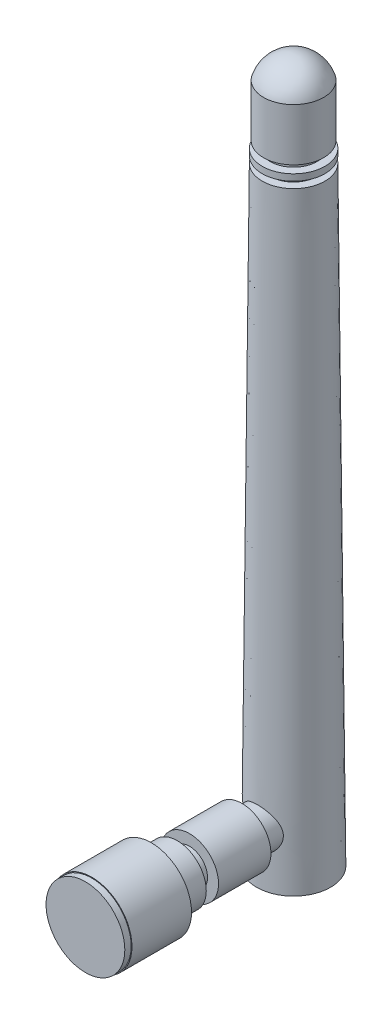
ISO-10303-21;
HEADER;
FILE_DESCRIPTION(('STEP AP214'),'2;1');
FILE_NAME('part.step','',(''),(''),'','','');
FILE_SCHEMA(('AUTOMOTIVE_DESIGN { 1 0 10303 214 1 1 1 1 }'));
ENDSEC;
DATA;
#1=APPLICATION_CONTEXT('core data for automotive mechanical design processes');
#2=APPLICATION_PROTOCOL_DEFINITION('international standard','automotive_design',2000,#1);
#3=PRODUCT_CONTEXT('',#1,'mechanical');
#4=PRODUCT('Part','Part','',(#3));
#5=PRODUCT_RELATED_PRODUCT_CATEGORY('part','',(#4));
#6=PRODUCT_DEFINITION_FORMATION('','',#4);
#7=PRODUCT_DEFINITION_CONTEXT('part definition',#1,'design');
#8=PRODUCT_DEFINITION('design','',#6,#7);
#9=PRODUCT_DEFINITION_SHAPE('','',#8);
#10=(LENGTH_UNIT() NAMED_UNIT(*) SI_UNIT(.MILLI.,.METRE.));
#11=(NAMED_UNIT(*) PLANE_ANGLE_UNIT() SI_UNIT($,.RADIAN.));
#12=(NAMED_UNIT(*) SI_UNIT($,.STERADIAN.) SOLID_ANGLE_UNIT());
#13=UNCERTAINTY_MEASURE_WITH_UNIT(LENGTH_MEASURE(1.E-05),#10,'distance_accuracy_value','');
#14=(GEOMETRIC_REPRESENTATION_CONTEXT(3) GLOBAL_UNCERTAINTY_ASSIGNED_CONTEXT((#13)) GLOBAL_UNIT_ASSIGNED_CONTEXT((#10,
#11,#12)) REPRESENTATION_CONTEXT('',''));
#15=CARTESIAN_POINT('',(0.,0.,0.));
#16=DIRECTION('',(0.,0.,1.));
#17=DIRECTION('',(1.,0.,0.));
#18=AXIS2_PLACEMENT_3D('',#15,#16,#17);
#19=CARTESIAN_POINT('',(0.,66.878718358439,0.));
#20=DIRECTION('',(0.,-1.,0.));
#21=DIRECTION('',(0.,0.,-1.));
#22=AXIS2_PLACEMENT_3D('',#19,#20,#21);
#23=CONICAL_SURFACE('',#22,3.9,0.00924068126425706);
#24=CARTESIAN_POINT('',(0.,66.878718358439,0.));
#25=DIRECTION('',(0.,1.,0.));
#26=DIRECTION('',(0.,0.,1.));
#27=AXIS2_PLACEMENT_3D('',#24,#25,#26);
#28=CIRCLE('',#27,3.9);
#29=CARTESIAN_POINT('',(0.,66.878718358439,3.9));
#30=VERTEX_POINT('',#29);
#31=EDGE_CURVE('E59',#30,#30,#28,.T.);
#32=ORIENTED_EDGE('',*,*,#31,.F.);
#33=EDGE_LOOP('',(#32));
#34=FACE_BOUND('',#33,.T.);
#35=CARTESIAN_POINT('',(0.,-8.87111604136676,0.));
#36=DIRECTION('',(0.,1.,0.));
#37=DIRECTION('',(0.,0.,1.));
#38=AXIS2_PLACEMENT_3D('',#35,#36,#37);
#39=CIRCLE('',#38,4.6);
#40=CARTESIAN_POINT('',(0.,-8.87111604136676,4.6));
#41=VERTEX_POINT('',#40);
#42=EDGE_CURVE('E56',#41,#41,#39,.T.);
#43=ORIENTED_EDGE('',*,*,#42,.T.);
#44=EDGE_LOOP('',(#43));
#45=FACE_BOUND('',#44,.T.);
#46=CARTESIAN_POINT('',(-1.81188369998939,-4.24712340383272,4.18160098269724));
#47=CARTESIAN_POINT('',(-1.90800079422493,-4.14686668908235,4.13894246014809));
#48=CARTESIAN_POINT('',(-1.99573985291126,-4.03870366584505,4.09585518862893));
#49=CARTESIAN_POINT('',(-2.15272282887463,-3.80834609579547,4.01315878241409));
#50=CARTESIAN_POINT('',(-2.22195311607326,-3.68614130262508,3.97355222528666));
#51=CARTESIAN_POINT('',(-2.34010995372417,-3.42894562192491,3.90237666064731));
#52=CARTESIAN_POINT('',(-2.38890193865032,-3.2938769642189,3.87086143597426));
#53=CARTESIAN_POINT('',(-2.46289967519262,-3.01518083519823,3.82115795220368));
#54=CARTESIAN_POINT('',(-2.48815075347143,-2.87157038045745,3.80294409680322));
#55=CARTESIAN_POINT('',(-2.51182158690223,-2.59792070904129,3.78430635381626));
#56=CARTESIAN_POINT('',(-2.51301905053102,-2.46824441868406,3.78206064735321));
#57=CARTESIAN_POINT('',(-2.49547427269947,-2.21069750159278,3.7908101387166));
#58=CARTESIAN_POINT('',(-2.47672997236209,-2.08282706268417,3.80180670374992));
#59=CARTESIAN_POINT('',(-2.42265225103293,-1.84294752338989,3.83384056953348));
#60=CARTESIAN_POINT('',(-2.38875959666115,-1.73048641458978,3.85400804463788));
#61=CARTESIAN_POINT('',(-2.30634544409267,-1.51271013373263,3.90154613502375));
#62=CARTESIAN_POINT('',(-2.2578194018209,-1.40739719384401,3.92891898743978));
#63=CARTESIAN_POINT('',(-2.14076176255133,-1.19318276158147,3.9917836547549));
#64=CARTESIAN_POINT('',(-2.07052002229425,-1.08538878455003,4.02785708749345));
#65=CARTESIAN_POINT('',(-1.91484876583947,-0.882132709184086,4.1020788403));
#66=CARTESIAN_POINT('',(-1.82940753841142,-0.786680218619441,4.1402287444485));
#67=CARTESIAN_POINT('',(-1.63228085024748,-0.597707219787739,4.2202950378212));
#68=CARTESIAN_POINT('',(-1.51861265138628,-0.506161136195988,4.26203074215315));
#69=CARTESIAN_POINT('',(-1.27564273261851,-0.343382655646764,4.33937522664175));
#70=CARTESIAN_POINT('',(-1.14634344287379,-0.272147106784256,4.37498495712153));
#71=CARTESIAN_POINT('',(-0.878977790864915,-0.154534178069233,4.43520645350547));
#72=CARTESIAN_POINT('',(-0.741261750653158,-0.107512101255404,4.46010019295468));
#73=CARTESIAN_POINT('',(-0.458203385548731,-0.0378892198873548,4.49733679951257));
#74=CARTESIAN_POINT('',(-0.312869376011272,-0.0152623459007339,4.50969306370323));
#75=CARTESIAN_POINT('',(-0.037278881926728,0.00306525281243654,4.51969389962914));
#76=CARTESIAN_POINT('',(0.0927386295809656,0.00162200356391065,4.51889901287441));
#77=CARTESIAN_POINT('',(0.35046257897627,-0.0212243623612817,4.50645172902873));
#78=CARTESIAN_POINT('',(0.478169246495492,-0.0426254845704317,4.49480041686252));
#79=CARTESIAN_POINT('',(0.723056775089021,-0.103207422776035,4.46240564535786));
#80=CARTESIAN_POINT('',(0.840451064279318,-0.141720333362131,4.44200465511752));
#81=CARTESIAN_POINT('',(1.06706734723755,-0.234805963623182,4.39396593924427));
#82=CARTESIAN_POINT('',(1.17628776496449,-0.289381770502136,4.36632682259428));
#83=CARTESIAN_POINT('',(1.3932812799913,-0.418083474394753,4.30348844900184));
#84=CARTESIAN_POINT('',(1.50018863127294,-0.493452398229985,4.26785314408554));
#85=CARTESIAN_POINT('',(1.70055560256624,-0.659266319264017,4.19370505684889));
#86=CARTESIAN_POINT('',(1.79400230704137,-0.749725618522834,4.15518956409001));
#87=CARTESIAN_POINT('',(1.9755563999417,-0.954950156209934,4.07436567702127));
#88=CARTESIAN_POINT('',(2.06190598794735,-1.07130100687768,4.03211333923057));
#89=CARTESIAN_POINT('',(2.21396216113315,-1.3185232217939,3.95328941459588));
#90=CARTESIAN_POINT('',(2.27968478437157,-1.44938319710291,3.91671342547011));
#91=CARTESIAN_POINT('',(2.37851300073252,-1.69902023350925,3.86005035798532));
#92=CARTESIAN_POINT('',(2.41530554299804,-1.81593297759047,3.83820104226189));
#93=CARTESIAN_POINT('',(2.47155026523378,-2.05523870209952,3.80486951809274));
#94=CARTESIAN_POINT('',(2.49102228368447,-2.1776252437211,3.79337544882109));
#95=CARTESIAN_POINT('',(2.51167834731379,-2.42488539887103,3.78247690888621));
#96=CARTESIAN_POINT('',(2.51280467628148,-2.54976562445247,3.78311057894174));
#97=CARTESIAN_POINT('',(2.49661048160589,-2.79767607685629,3.79655636873999));
#98=CARTESIAN_POINT('',(2.47928235701406,-2.92070552021225,3.8093735063282));
#99=CARTESIAN_POINT('',(2.42832451693941,-3.15618767559648,3.84461385739231));
#100=CARTESIAN_POINT('',(2.39542388302347,-3.26886770047523,3.86660267386873));
#101=CARTESIAN_POINT('',(2.31498863569296,-3.48714812891895,3.91763122529498));
#102=CARTESIAN_POINT('',(2.26744880061174,-3.59274598994879,3.94667347535654));
#103=CARTESIAN_POINT('',(2.152068713143,-3.80841910553983,4.0131463489087));
#104=CARTESIAN_POINT('',(2.0824077790829,-3.91733423684227,4.05117498699361));
#105=CARTESIAN_POINT('',(1.92763406269446,-4.12285708921694,4.12916314254925));
#106=CARTESIAN_POINT('',(1.84250911852169,-4.21945502079544,4.16912416148099));
#107=CARTESIAN_POINT('',(1.64579052054966,-4.41083106274781,4.25285277511971));
#108=CARTESIAN_POINT('',(1.5321802744262,-4.50364361756357,4.2964160996338));
#109=CARTESIAN_POINT('',(1.28891847312818,-4.6688998382838,4.37713796820322));
#110=CARTESIAN_POINT('',(1.15926987199316,-4.74134724714173,4.41429768870409));
#111=CARTESIAN_POINT('',(0.891465115606681,-4.86088057030074,4.47705172784531));
#112=CARTESIAN_POINT('',(0.753731643879434,-4.90872541904655,4.5029876364801));
#113=CARTESIAN_POINT('',(0.470375830295851,-4.97994154816484,4.5419811271118));
#114=CARTESIAN_POINT('',(0.324762670127483,-5.00334069407911,4.55505337134942));
#115=CARTESIAN_POINT('',(0.0492038123630123,-5.02294052758894,4.56599791967481));
#116=CARTESIAN_POINT('',(-0.0804715112672798,-5.02212674449568,4.56553876264345));
#117=CARTESIAN_POINT('',(-0.337633643060869,-5.00062965875537,4.55354607611887));
#118=CARTESIAN_POINT('',(-0.465120608930987,-4.9799477940983,4.54201334809633));
#119=CARTESIAN_POINT('',(-0.709303045863642,-4.92094470767937,4.5096556517351));
#120=CARTESIAN_POINT('',(-0.826225390686674,-4.88334093448581,4.48920959322916));
#121=CARTESIAN_POINT('',(-1.05201162443628,-4.79225146168992,4.44086232468479));
#122=CARTESIAN_POINT('',(-1.16087529635004,-4.73876533458432,4.41296091397364));
#123=CARTESIAN_POINT('',(-1.36621316395028,-4.61898563306535,4.35255056486455));
#124=CARTESIAN_POINT('',(-1.46291890831163,-4.55302365971327,4.32016573240169));
#125=CARTESIAN_POINT('',(-1.64565813478,-4.40892032578009,4.25248789156414));
#126=CARTESIAN_POINT('',(-1.73168715091119,-4.33077389918785,4.21719367642592));
#127=CARTESIAN_POINT('',(-1.81188369998939,-4.24712340383272,4.18160098269724));
#128=B_SPLINE_CURVE_WITH_KNOTS('',3,(#46,#47,#48,#49,#50,#51,#52,#53,#54,#55,#56,#57,#58,#59,
#60,#61,#62,#63,#64,#65,#66,#67,#68,#69,#70,#71,#72,#73,#74,#75,#76,#77,#78,#79,#80,#81,#82,#83,
#84,#85,#86,#87,#88,#89,#90,#91,#92,#93,#94,#95,#96,#97,#98,#99,#100,#101,#102,#103,#104,#105,
#106,#107,#108,#109,#110,#111,#112,#113,#114,#115,#116,#117,#118,#119,#120,#121,#122,#123,#124,
#125,#126,#127),.UNSPECIFIED.,.T.,.F.,(4,2,2,2,2,2,2,2,2,2,2,2,2,2,2,2,2,2,2,2,2,2,2,2,2,2,2,2,
2,2,2,2,2,2,2,2,2,2,2,2,4),(0.,0.435486898235772,0.871293616297721,1.30992621816669,
1.74771250323975,2.13461006315413,2.5215475719825,2.87765509093757,3.23387330527936,
3.6331913765922,4.03281846638509,4.48601873608434,4.93914863724422,5.3794927527848,
5.8193658357944,6.20746025851896,6.59551590162088,6.96959952143097,7.3437550851425,
7.74883533245428,8.15430170297281,8.60498863004513,9.05532426192376,9.42723655076879,
9.79872231032598,10.1713765527451,10.5441843419246,10.9010436902656,11.2580304747427,
11.6607608252294,12.0638092896338,12.5206795665569,12.9774658193376,13.419158138763,
13.860346424009,14.2473894037885,14.6344043727111,15.0063648298525,15.3783352999133,
15.7415380478543,16.1048922117005),.UNSPECIFIED.);
#129=CARTESIAN_POINT('',(-1.81188369998939,-4.24712340383272,4.18160098269724));
#130=VERTEX_POINT('',#129);
#131=EDGE_CURVE('E36',#130,#130,#128,.T.);
#132=ORIENTED_EDGE('',*,*,#131,.T.);
#133=EDGE_LOOP('',(#132));
#134=FACE_BOUND('',#133,.T.);
#135=ADVANCED_FACE('F32',(#34,#45,#134),#23,.T.);
#136=CARTESIAN_POINT('',(-2.89999999999999,68.478718358439,0.));
#137=DIRECTION('',(0.,1.,0.));
#138=DIRECTION('',(0.,0.,1.));
#139=AXIS2_PLACEMENT_3D('',#136,#137,#138);
#140=PLANE('',#139);
#141=CARTESIAN_POINT('',(0.,68.478718358439,0.));
#142=DIRECTION('',(0.,1.,0.));
#143=DIRECTION('',(0.,0.,1.));
#144=AXIS2_PLACEMENT_3D('',#141,#142,#143);
#145=CIRCLE('',#144,3.9);
#146=CARTESIAN_POINT('',(0.,68.478718358439,3.9));
#147=VERTEX_POINT('',#146);
#148=EDGE_CURVE('E71',#147,#147,#145,.T.);
#149=ORIENTED_EDGE('',*,*,#148,.T.);
#150=EDGE_LOOP('',(#149));
#151=FACE_BOUND('',#150,.T.);
#152=CARTESIAN_POINT('',(0.,68.478718358439,0.));
#153=DIRECTION('',(0.,1.,0.));
#154=DIRECTION('',(0.,0.,1.));
#155=AXIS2_PLACEMENT_3D('',#152,#153,#154);
#156=CIRCLE('',#155,2.89999999999999);
#157=CARTESIAN_POINT('',(0.,68.478718358439,2.89999999999999));
#158=VERTEX_POINT('',#157);
#159=EDGE_CURVE('E10',#158,#158,#156,.T.);
#160=ORIENTED_EDGE('',*,*,#159,.F.);
#161=EDGE_LOOP('',(#160));
#162=FACE_BOUND('',#161,.T.);
#163=ADVANCED_FACE('F34',(#151,#162),#140,.T.);
#164=CARTESIAN_POINT('',(0.,100.774977187123,0.));
#165=DIRECTION('',(0.,1.,0.));
#166=DIRECTION('',(0.,0.,1.));
#167=AXIS2_PLACEMENT_3D('',#164,#165,#166);
#168=CYLINDRICAL_SURFACE('',#167,2.89999999999999);
#169=ORIENTED_EDGE('',*,*,#159,.T.);
#170=EDGE_LOOP('',(#169));
#171=FACE_BOUND('',#170,.T.);
#172=CARTESIAN_POINT('',(0.,69.3165062893689,0.));
#173=DIRECTION('',(0.,1.,0.));
#174=DIRECTION('',(0.,0.,1.));
#175=AXIS2_PLACEMENT_3D('',#172,#173,#174);
#176=CIRCLE('',#175,2.89999999999999);
#177=CARTESIAN_POINT('',(0.,69.3165062893689,2.89999999999999));
#178=VERTEX_POINT('',#177);
#179=EDGE_CURVE('E44',#178,#178,#176,.T.);
#180=ORIENTED_EDGE('',*,*,#179,.F.);
#181=EDGE_LOOP('',(#180));
#182=FACE_BOUND('',#181,.T.);
#183=ADVANCED_FACE('F187',(#171,#182),#168,.T.);
#184=CARTESIAN_POINT('',(-2.89999999999999,69.3165062893689,0.));
#185=DIRECTION('',(0.,-1.,0.));
#186=DIRECTION('',(0.,0.,-1.));
#187=AXIS2_PLACEMENT_3D('',#184,#185,#186);
#188=PLANE('',#187);
#189=ORIENTED_EDGE('',*,*,#179,.T.);
#190=EDGE_LOOP('',(#189));
#191=FACE_BOUND('',#190,.T.);
#192=CARTESIAN_POINT('',(0.,69.3165062893689,0.));
#193=DIRECTION('',(0.,1.,0.));
#194=DIRECTION('',(0.,0.,1.));
#195=AXIS2_PLACEMENT_3D('',#192,#193,#194);
#196=CIRCLE('',#195,3.73509107576063);
#197=CARTESIAN_POINT('',(0.,69.3165062893689,3.73509107576063));
#198=VERTEX_POINT('',#197);
#199=EDGE_CURVE('E48',#198,#198,#196,.T.);
#200=ORIENTED_EDGE('',*,*,#199,.F.);
#201=EDGE_LOOP('',(#200));
#202=FACE_BOUND('',#201,.T.);
#203=ADVANCED_FACE('F207',(#191,#202),#188,.T.);
#204=CARTESIAN_POINT('',(0.,100.774977187123,0.));
#205=DIRECTION('',(0.,1.,0.));
#206=DIRECTION('',(0.,0.,1.));
#207=AXIS2_PLACEMENT_3D('',#204,#205,#206);
#208=CYLINDRICAL_SURFACE('',#207,3.73509107576063);
#209=ORIENTED_EDGE('',*,*,#199,.T.);
#210=EDGE_LOOP('',(#209));
#211=FACE_BOUND('',#210,.T.);
#212=CARTESIAN_POINT('',(0.,75.8165062893689,0.));
#213=DIRECTION('',(0.,1.,0.));
#214=DIRECTION('',(0.,0.,1.));
#215=AXIS2_PLACEMENT_3D('',#212,#213,#214);
#216=CIRCLE('',#215,3.73509107576063);
#217=CARTESIAN_POINT('',(0.,75.8165062893689,3.73509107576063));
#218=VERTEX_POINT('',#217);
#219=EDGE_CURVE('E53',#218,#218,#216,.T.);
#220=ORIENTED_EDGE('',*,*,#219,.F.);
#221=EDGE_LOOP('',(#220));
#222=FACE_BOUND('',#221,.T.);
#223=ADVANCED_FACE('F203',(#211,#222),#208,.T.);
#224=CARTESIAN_POINT('',(0.,74.7424262936992,0.));
#225=DIRECTION('',(0.,1.,0.));
#226=DIRECTION('',(-1.,0.,0.));
#227=AXIS2_PLACEMENT_3D('',#224,#225,#226);
#228=SPHERICAL_SURFACE('',#227,3.88645766493405);
#229=ORIENTED_EDGE('',*,*,#219,.T.);
#230=EDGE_LOOP('',(#229));
#231=FACE_BOUND('',#230,.T.);
#232=ADVANCED_FACE('F199',(#231),#228,.T.);
#233=CARTESIAN_POINT('',(0.,-8.87111604136676,0.));
#234=DIRECTION('',(0.,-1.,0.));
#235=DIRECTION('',(0.,0.,-1.));
#236=AXIS2_PLACEMENT_3D('',#233,#234,#235);
#237=PLANE('',#236);
#238=ORIENTED_EDGE('',*,*,#42,.F.);
#239=EDGE_LOOP('',(#238));
#240=FACE_BOUND('',#239,.T.);
#241=ADVANCED_FACE('F196',(#240),#237,.T.);
#242=CARTESIAN_POINT('',(-3.9,66.878718358439,0.));
#243=DIRECTION('',(0.,1.,0.));
#244=DIRECTION('',(0.,0.,1.));
#245=AXIS2_PLACEMENT_3D('',#242,#243,#244);
#246=PLANE('',#245);
#247=ORIENTED_EDGE('',*,*,#31,.T.);
#248=EDGE_LOOP('',(#247));
#249=FACE_BOUND('',#248,.T.);
#250=CARTESIAN_POINT('',(0.,66.878718358439,0.));
#251=DIRECTION('',(0.,1.,0.));
#252=DIRECTION('',(0.,0.,1.));
#253=AXIS2_PLACEMENT_3D('',#250,#251,#252);
#254=CIRCLE('',#253,2.89999999999999);
#255=CARTESIAN_POINT('',(0.,66.878718358439,2.89999999999999));
#256=VERTEX_POINT('',#255);
#257=EDGE_CURVE('E62',#256,#256,#254,.T.);
#258=ORIENTED_EDGE('',*,*,#257,.F.);
#259=EDGE_LOOP('',(#258));
#260=FACE_BOUND('',#259,.T.);
#261=ADVANCED_FACE('F194',(#249,#260),#246,.T.);
#262=CARTESIAN_POINT('',(0.,100.774977187123,0.));
#263=DIRECTION('',(0.,1.,0.));
#264=DIRECTION('',(0.,0.,1.));
#265=AXIS2_PLACEMENT_3D('',#262,#263,#264);
#266=CYLINDRICAL_SURFACE('',#265,2.89999999999999);
#267=ORIENTED_EDGE('',*,*,#257,.T.);
#268=EDGE_LOOP('',(#267));
#269=FACE_BOUND('',#268,.T.);
#270=CARTESIAN_POINT('',(0.,67.678718358439,0.));
#271=DIRECTION('',(0.,1.,0.));
#272=DIRECTION('',(0.,0.,1.));
#273=AXIS2_PLACEMENT_3D('',#270,#271,#272);
#274=CIRCLE('',#273,2.89999999999999);
#275=CARTESIAN_POINT('',(0.,67.678718358439,2.89999999999999));
#276=VERTEX_POINT('',#275);
#277=EDGE_CURVE('E65',#276,#276,#274,.T.);
#278=ORIENTED_EDGE('',*,*,#277,.F.);
#279=EDGE_LOOP('',(#278));
#280=FACE_BOUND('',#279,.T.);
#281=ADVANCED_FACE('F244',(#269,#280),#266,.T.);
#282=CARTESIAN_POINT('',(-3.9,67.678718358439,0.));
#283=DIRECTION('',(0.,-1.,0.));
#284=DIRECTION('',(0.,0.,-1.));
#285=AXIS2_PLACEMENT_3D('',#282,#283,#284);
#286=PLANE('',#285);
#287=ORIENTED_EDGE('',*,*,#277,.T.);
#288=EDGE_LOOP('',(#287));
#289=FACE_BOUND('',#288,.T.);
#290=CARTESIAN_POINT('',(0.,67.678718358439,0.));
#291=DIRECTION('',(0.,1.,0.));
#292=DIRECTION('',(0.,0.,1.));
#293=AXIS2_PLACEMENT_3D('',#290,#291,#292);
#294=CIRCLE('',#293,3.9);
#295=CARTESIAN_POINT('',(0.,67.678718358439,3.9));
#296=VERTEX_POINT('',#295);
#297=EDGE_CURVE('E68',#296,#296,#294,.T.);
#298=ORIENTED_EDGE('',*,*,#297,.F.);
#299=EDGE_LOOP('',(#298));
#300=FACE_BOUND('',#299,.T.);
#301=ADVANCED_FACE('F177',(#289,#300),#286,.T.);
#302=CARTESIAN_POINT('',(0.,100.774977187123,0.));
#303=DIRECTION('',(0.,1.,0.));
#304=DIRECTION('',(0.,0.,1.));
#305=AXIS2_PLACEMENT_3D('',#302,#303,#304);
#306=CYLINDRICAL_SURFACE('',#305,3.9);
#307=ORIENTED_EDGE('',*,*,#297,.T.);
#308=EDGE_LOOP('',(#307));
#309=FACE_BOUND('',#308,.T.);
#310=ORIENTED_EDGE('',*,*,#148,.F.);
#311=EDGE_LOOP('',(#310));
#312=FACE_BOUND('',#311,.T.);
#313=ADVANCED_FACE('F172',(#309,#312),#306,.T.);
#314=CARTESIAN_POINT('',(0.,-2.51004947612662,44.5034584823365));
#315=DIRECTION('',(0.,0.,1.));
#316=DIRECTION('',(1.,0.,0.));
#317=AXIS2_PLACEMENT_3D('',#314,#315,#316);
#318=CYLINDRICAL_SURFACE('',#317,2.51004947612662);
#319=ORIENTED_EDGE('',*,*,#131,.F.);
#320=EDGE_LOOP('',(#319));
#321=FACE_BOUND('',#320,.T.);
#322=CARTESIAN_POINT('',(0.,-2.51004947612662,6.42927660341974));
#323=DIRECTION('',(0.,0.,1.));
#324=DIRECTION('',(1.,0.,0.));
#325=AXIS2_PLACEMENT_3D('',#322,#323,#324);
#326=CIRCLE('',#325,2.51004947612662);
#327=CARTESIAN_POINT('',(2.51004947612662,-2.51004947612662,6.42927660341974));
#328=VERTEX_POINT('',#327);
#329=EDGE_CURVE('E74',#328,#328,#326,.T.);
#330=ORIENTED_EDGE('',*,*,#329,.F.);
#331=EDGE_LOOP('',(#330));
#332=FACE_BOUND('',#331,.T.);
#333=ADVANCED_FACE('F167',(#321,#332),#318,.T.);
#334=CARTESIAN_POINT('',(0.,0.,6.42927660341974));
#335=DIRECTION('',(0.,0.,1.));
#336=DIRECTION('',(1.,0.,0.));
#337=AXIS2_PLACEMENT_3D('',#334,#335,#336);
#338=PLANE('',#337);
#339=CARTESIAN_POINT('',(0.,-2.51004947612662,6.42927660341974));
#340=DIRECTION('',(0.,0.,1.));
#341=DIRECTION('',(1.,0.,0.));
#342=AXIS2_PLACEMENT_3D('',#339,#340,#341);
#343=CIRCLE('',#342,3.60941360741938);
#344=CARTESIAN_POINT('',(3.60941360741938,-2.51004947612662,6.42927660341974));
#345=VERTEX_POINT('',#344);
#346=EDGE_CURVE('E77',#345,#345,#343,.T.);
#347=ORIENTED_EDGE('',*,*,#346,.F.);
#348=EDGE_LOOP('',(#347));
#349=FACE_BOUND('',#348,.T.);
#350=ORIENTED_EDGE('',*,*,#329,.T.);
#351=EDGE_LOOP('',(#350));
#352=FACE_BOUND('',#351,.T.);
#353=ADVANCED_FACE('F161',(#349,#352),#338,.F.);
#354=CARTESIAN_POINT('',(0.,-2.51004947612662,44.5034584823365));
#355=DIRECTION('',(0.,0.,1.));
#356=DIRECTION('',(1.,0.,0.));
#357=AXIS2_PLACEMENT_3D('',#354,#355,#356);
#358=CYLINDRICAL_SURFACE('',#357,3.60941360741938);
#359=CARTESIAN_POINT('',(0.,-2.51004947612662,12.95));
#360=DIRECTION('',(0.,0.,1.));
#361=DIRECTION('',(1.,0.,0.));
#362=AXIS2_PLACEMENT_3D('',#359,#360,#361);
#363=CIRCLE('',#362,3.60941360741938);
#364=CARTESIAN_POINT('',(3.60941360741938,-2.51004947612662,12.95));
#365=VERTEX_POINT('',#364);
#366=EDGE_CURVE('E80',#365,#365,#363,.T.);
#367=ORIENTED_EDGE('',*,*,#366,.F.);
#368=EDGE_LOOP('',(#367));
#369=FACE_BOUND('',#368,.T.);
#370=ORIENTED_EDGE('',*,*,#346,.T.);
#371=EDGE_LOOP('',(#370));
#372=FACE_BOUND('',#371,.T.);
#373=ADVANCED_FACE('F155',(#369,#372),#358,.T.);
#374=CARTESIAN_POINT('',(0.,-0.266872358286114,12.95));
#375=DIRECTION('',(0.,0.,-1.));
#376=DIRECTION('',(-1.,0.,0.));
#377=AXIS2_PLACEMENT_3D('',#374,#375,#376);
#378=PLANE('',#377);
#379=CARTESIAN_POINT('',(0.,-2.51004947612662,12.95));
#380=DIRECTION('',(0.,0.,1.));
#381=DIRECTION('',(1.,0.,0.));
#382=AXIS2_PLACEMENT_3D('',#379,#380,#381);
#383=CIRCLE('',#382,2.24317711784051);
#384=CARTESIAN_POINT('',(2.24317711784051,-2.51004947612662,12.95));
#385=VERTEX_POINT('',#384);
#386=EDGE_CURVE('E83',#385,#385,#383,.T.);
#387=ORIENTED_EDGE('',*,*,#386,.F.);
#388=EDGE_LOOP('',(#387));
#389=FACE_BOUND('',#388,.T.);
#390=ORIENTED_EDGE('',*,*,#366,.T.);
#391=EDGE_LOOP('',(#390));
#392=FACE_BOUND('',#391,.T.);
#393=ADVANCED_FACE('F149',(#389,#392),#378,.F.);
#394=CARTESIAN_POINT('',(0.,-2.51004947612662,44.5034584823365));
#395=DIRECTION('',(0.,0.,1.));
#396=DIRECTION('',(1.,0.,0.));
#397=AXIS2_PLACEMENT_3D('',#394,#395,#396);
#398=CYLINDRICAL_SURFACE('',#397,2.24317711784051);
#399=CARTESIAN_POINT('',(0.,-2.51004947612662,14.4734706497019));
#400=DIRECTION('',(0.,0.,1.));
#401=DIRECTION('',(1.,0.,0.));
#402=AXIS2_PLACEMENT_3D('',#399,#400,#401);
#403=CIRCLE('',#402,2.24317711784051);
#404=CARTESIAN_POINT('',(2.24317711784051,-2.51004947612662,14.4734706497019));
#405=VERTEX_POINT('',#404);
#406=EDGE_CURVE('E86',#405,#405,#403,.T.);
#407=ORIENTED_EDGE('',*,*,#406,.F.);
#408=EDGE_LOOP('',(#407));
#409=FACE_BOUND('',#408,.T.);
#410=ORIENTED_EDGE('',*,*,#386,.T.);
#411=EDGE_LOOP('',(#410));
#412=FACE_BOUND('',#411,.T.);
#413=ADVANCED_FACE('F143',(#409,#412),#398,.T.);
#414=CARTESIAN_POINT('',(0.,1.09936413129276,14.4734706497019));
#415=DIRECTION('',(0.,0.,1.));
#416=DIRECTION('',(1.,0.,0.));
#417=AXIS2_PLACEMENT_3D('',#414,#415,#416);
#418=PLANE('',#417);
#419=CARTESIAN_POINT('',(0.,-2.51004947612662,14.4734706497019));
#420=DIRECTION('',(0.,0.,1.));
#421=DIRECTION('',(1.,0.,0.));
#422=AXIS2_PLACEMENT_3D('',#419,#420,#421);
#423=CIRCLE('',#422,3.60941360741938);
#424=CARTESIAN_POINT('',(3.60941360741938,-2.51004947612662,14.4734706497019));
#425=VERTEX_POINT('',#424);
#426=EDGE_CURVE('E89',#425,#425,#423,.T.);
#427=ORIENTED_EDGE('',*,*,#426,.F.);
#428=EDGE_LOOP('',(#427));
#429=FACE_BOUND('',#428,.T.);
#430=ORIENTED_EDGE('',*,*,#406,.T.);
#431=EDGE_LOOP('',(#430));
#432=FACE_BOUND('',#431,.T.);
#433=ADVANCED_FACE('F137',(#429,#432),#418,.F.);
#434=CARTESIAN_POINT('',(0.,-2.51004947612662,44.5034584823365));
#435=DIRECTION('',(0.,0.,1.));
#436=DIRECTION('',(1.,0.,0.));
#437=AXIS2_PLACEMENT_3D('',#434,#435,#436);
#438=CYLINDRICAL_SURFACE('',#437,3.60941360741938);
#439=CARTESIAN_POINT('',(0.,-2.51004947612662,17.7));
#440=DIRECTION('',(0.,0.,1.));
#441=DIRECTION('',(1.,0.,0.));
#442=AXIS2_PLACEMENT_3D('',#439,#440,#441);
#443=CIRCLE('',#442,3.60941360741938);
#444=CARTESIAN_POINT('',(3.60941360741938,-2.51004947612662,17.7));
#445=VERTEX_POINT('',#444);
#446=EDGE_CURVE('E92',#445,#445,#443,.T.);
#447=ORIENTED_EDGE('',*,*,#446,.F.);
#448=EDGE_LOOP('',(#447));
#449=FACE_BOUND('',#448,.T.);
#450=ORIENTED_EDGE('',*,*,#426,.T.);
#451=EDGE_LOOP('',(#450));
#452=FACE_BOUND('',#451,.T.);
#453=ADVANCED_FACE('F131',(#449,#452),#438,.T.);
#454=CARTESIAN_POINT('',(0.,1.09936413129276,17.7));
#455=DIRECTION('',(0.,0.,1.));
#456=DIRECTION('',(1.,0.,0.));
#457=AXIS2_PLACEMENT_3D('',#454,#455,#456);
#458=PLANE('',#457);
#459=CARTESIAN_POINT('',(0.,-2.51004947612662,17.7));
#460=DIRECTION('',(0.,0.,1.));
#461=DIRECTION('',(1.,0.,0.));
#462=AXIS2_PLACEMENT_3D('',#459,#460,#461);
#463=CIRCLE('',#462,5.);
#464=CARTESIAN_POINT('',(5.,-2.51004947612662,17.7));
#465=VERTEX_POINT('',#464);
#466=EDGE_CURVE('E95',#465,#465,#463,.T.);
#467=ORIENTED_EDGE('',*,*,#466,.F.);
#468=EDGE_LOOP('',(#467));
#469=FACE_BOUND('',#468,.T.);
#470=ORIENTED_EDGE('',*,*,#446,.T.);
#471=EDGE_LOOP('',(#470));
#472=FACE_BOUND('',#471,.T.);
#473=ADVANCED_FACE('F125',(#469,#472),#458,.F.);
#474=CARTESIAN_POINT('',(0.,-2.51004947612662,44.5034584823365));
#475=DIRECTION('',(0.,0.,1.));
#476=DIRECTION('',(1.,0.,0.));
#477=AXIS2_PLACEMENT_3D('',#474,#475,#476);
#478=CYLINDRICAL_SURFACE('',#477,5.);
#479=CARTESIAN_POINT('',(0.,-2.51004947612662,25.1093978031628));
#480=DIRECTION('',(0.,0.,1.));
#481=DIRECTION('',(1.,0.,0.));
#482=AXIS2_PLACEMENT_3D('',#479,#480,#481);
#483=CIRCLE('',#482,5.);
#484=CARTESIAN_POINT('',(5.,-2.51004947612662,25.1093978031628));
#485=VERTEX_POINT('',#484);
#486=EDGE_CURVE('E98',#485,#485,#483,.T.);
#487=ORIENTED_EDGE('',*,*,#486,.F.);
#488=EDGE_LOOP('',(#487));
#489=FACE_BOUND('',#488,.T.);
#490=ORIENTED_EDGE('',*,*,#466,.T.);
#491=EDGE_LOOP('',(#490));
#492=FACE_BOUND('',#491,.T.);
#493=ADVANCED_FACE('F119',(#489,#492),#478,.T.);
#494=CARTESIAN_POINT('',(0.,2.48995052387338,25.1093978031628));
#495=DIRECTION('',(0.,0.,-1.));
#496=DIRECTION('',(-1.,0.,0.));
#497=AXIS2_PLACEMENT_3D('',#494,#495,#496);
#498=PLANE('',#497);
#499=CARTESIAN_POINT('',(0.,-2.51004947612662,25.1093978031628));
#500=DIRECTION('',(0.,0.,1.));
#501=DIRECTION('',(1.,0.,0.));
#502=AXIS2_PLACEMENT_3D('',#499,#500,#501);
#503=CIRCLE('',#502,4.9);
#504=CARTESIAN_POINT('',(4.9,-2.51004947612662,25.1093978031628));
#505=VERTEX_POINT('',#504);
#506=EDGE_CURVE('E101',#505,#505,#503,.T.);
#507=ORIENTED_EDGE('',*,*,#506,.F.);
#508=EDGE_LOOP('',(#507));
#509=FACE_BOUND('',#508,.T.);
#510=ORIENTED_EDGE('',*,*,#486,.T.);
#511=EDGE_LOOP('',(#510));
#512=FACE_BOUND('',#511,.T.);
#513=ADVANCED_FACE('F113',(#509,#512),#498,.F.);
#514=CARTESIAN_POINT('',(0.,-2.51004947612662,44.5034584823365));
#515=DIRECTION('',(0.,0.,1.));
#516=DIRECTION('',(1.,0.,0.));
#517=AXIS2_PLACEMENT_3D('',#514,#515,#516);
#518=CYLINDRICAL_SURFACE('',#517,4.9);
#519=CARTESIAN_POINT('',(0.,-2.51004947612662,25.9));
#520=DIRECTION('',(0.,0.,1.));
#521=DIRECTION('',(1.,0.,0.));
#522=AXIS2_PLACEMENT_3D('',#519,#520,#521);
#523=CIRCLE('',#522,4.9);
#524=CARTESIAN_POINT('',(4.9,-2.51004947612662,25.9));
#525=VERTEX_POINT('',#524);
#526=EDGE_CURVE('E104',#525,#525,#523,.T.);
#527=ORIENTED_EDGE('',*,*,#526,.F.);
#528=EDGE_LOOP('',(#527));
#529=FACE_BOUND('',#528,.T.);
#530=ORIENTED_EDGE('',*,*,#506,.T.);
#531=EDGE_LOOP('',(#530));
#532=FACE_BOUND('',#531,.T.);
#533=ADVANCED_FACE('F110',(#529,#532),#518,.T.);
#534=CARTESIAN_POINT('',(0.,2.38995052387338,25.9));
#535=DIRECTION('',(0.,0.,-1.));
#536=DIRECTION('',(-1.,0.,0.));
#537=AXIS2_PLACEMENT_3D('',#534,#535,#536);
#538=PLANE('',#537);
#539=ORIENTED_EDGE('',*,*,#526,.T.);
#540=EDGE_LOOP('',(#539));
#541=FACE_BOUND('',#540,.T.);
#542=ADVANCED_FACE('F108',(#541),#538,.F.);
#543=CLOSED_SHELL('',(#135,#163,#183,#203,#223,#232,#241,#261,#281,#301,#313,#333,#353,#373,
#393,#413,#433,#453,#473,#493,#513,#533,#542));
#544=MANIFOLD_SOLID_BREP('B2',#543);
#545=ADVANCED_BREP_SHAPE_REPRESENTATION('',(#18,#544),#14);
#546=SHAPE_DEFINITION_REPRESENTATION(#9,#545);
ENDSEC;
END-ISO-10303-21;
